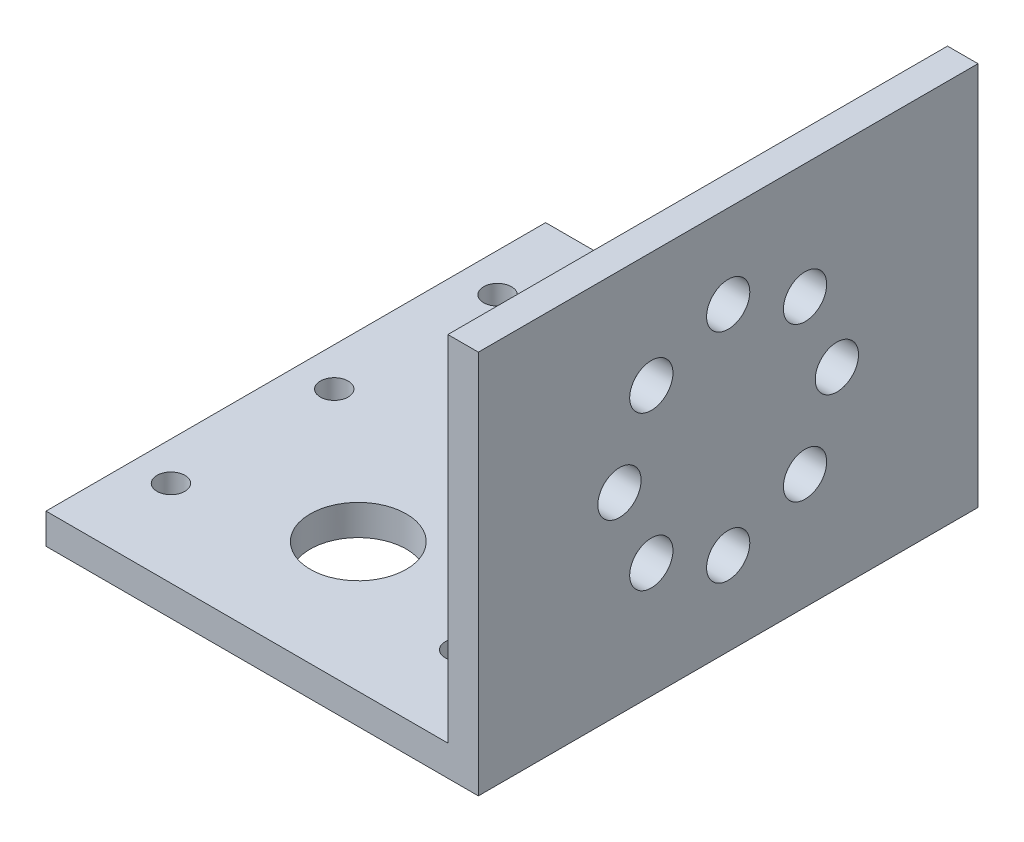
ISO-10303-21;
HEADER;
FILE_DESCRIPTION(('STEP AP214'),'2;1');
FILE_NAME('part.step','',(''),(''),'','','');
FILE_SCHEMA(('AUTOMOTIVE_DESIGN { 1 0 10303 214 1 1 1 1 }'));
ENDSEC;
DATA;
#1=APPLICATION_CONTEXT('core data for automotive mechanical design processes');
#2=APPLICATION_PROTOCOL_DEFINITION('international standard','automotive_design',2000,#1);
#3=PRODUCT_CONTEXT('',#1,'mechanical');
#4=PRODUCT('Part','Part','',(#3));
#5=PRODUCT_RELATED_PRODUCT_CATEGORY('part','',(#4));
#6=PRODUCT_DEFINITION_FORMATION('','',#4);
#7=PRODUCT_DEFINITION_CONTEXT('part definition',#1,'design');
#8=PRODUCT_DEFINITION('design','',#6,#7);
#9=PRODUCT_DEFINITION_SHAPE('','',#8);
#10=(LENGTH_UNIT() NAMED_UNIT(*) SI_UNIT(.MILLI.,.METRE.));
#11=(NAMED_UNIT(*) PLANE_ANGLE_UNIT() SI_UNIT($,.RADIAN.));
#12=(NAMED_UNIT(*) SI_UNIT($,.STERADIAN.) SOLID_ANGLE_UNIT());
#13=UNCERTAINTY_MEASURE_WITH_UNIT(LENGTH_MEASURE(1.E-05),#10,'distance_accuracy_value','');
#14=(GEOMETRIC_REPRESENTATION_CONTEXT(3) GLOBAL_UNCERTAINTY_ASSIGNED_CONTEXT((#13)) GLOBAL_UNIT_ASSIGNED_CONTEXT((#10,
#11,#12)) REPRESENTATION_CONTEXT('',''));
#15=CARTESIAN_POINT('',(0.,0.,0.));
#16=DIRECTION('',(0.,0.,1.));
#17=DIRECTION('',(1.,0.,0.));
#18=AXIS2_PLACEMENT_3D('',#15,#16,#17);
#19=CARTESIAN_POINT('',(3.175,36.825,52.));
#20=DIRECTION('',(-1.,0.,0.));
#21=DIRECTION('',(0.,-1.,0.));
#22=AXIS2_PLACEMENT_3D('',#19,#20,#21);
#23=PLANE('',#22);
#24=CARTESIAN_POINT('',(3.175,28.1387084989848,26.));
#25=DIRECTION('',(1.,0.,0.));
#26=DIRECTION('',(0.,0.,-1.));
#27=AXIS2_PLACEMENT_3D('',#24,#25,#26);
#28=CIRCLE('',#27,2.25);
#29=CARTESIAN_POINT('',(3.175,28.1387084989848,23.75));
#30=VERTEX_POINT('',#29);
#31=EDGE_CURVE('E225',#30,#30,#28,.T.);
#32=ORIENTED_EDGE('',*,*,#31,.F.);
#33=EDGE_LOOP('',(#32));
#34=FACE_BOUND('',#33,.T.);
#35=CARTESIAN_POINT('',(3.175,16.825,14.6862915010152));
#36=DIRECTION('',(1.,0.,0.));
#37=DIRECTION('',(0.,0.,-1.));
#38=AXIS2_PLACEMENT_3D('',#35,#36,#37);
#39=CIRCLE('',#38,2.25);
#40=CARTESIAN_POINT('',(3.175,16.825,12.4362915010152));
#41=VERTEX_POINT('',#40);
#42=EDGE_CURVE('E210',#41,#41,#39,.T.);
#43=ORIENTED_EDGE('',*,*,#42,.F.);
#44=EDGE_LOOP('',(#43));
#45=FACE_BOUND('',#44,.T.);
#46=CARTESIAN_POINT('',(3.175,8.825,18.));
#47=DIRECTION('',(1.,0.,0.));
#48=DIRECTION('',(0.,0.,-1.));
#49=AXIS2_PLACEMENT_3D('',#46,#47,#48);
#50=CIRCLE('',#49,2.25);
#51=CARTESIAN_POINT('',(3.175,8.825,15.75));
#52=VERTEX_POINT('',#51);
#53=EDGE_CURVE('E206',#52,#52,#50,.T.);
#54=ORIENTED_EDGE('',*,*,#53,.F.);
#55=EDGE_LOOP('',(#54));
#56=FACE_BOUND('',#55,.T.);
#57=CARTESIAN_POINT('',(3.175,5.51129150101524,26.));
#58=DIRECTION('',(1.,0.,0.));
#59=DIRECTION('',(0.,0.,-1.));
#60=AXIS2_PLACEMENT_3D('',#57,#58,#59);
#61=CIRCLE('',#60,2.25);
#62=CARTESIAN_POINT('',(3.175,5.51129150101524,23.75));
#63=VERTEX_POINT('',#62);
#64=EDGE_CURVE('E202',#63,#63,#61,.T.);
#65=ORIENTED_EDGE('',*,*,#64,.F.);
#66=EDGE_LOOP('',(#65));
#67=FACE_BOUND('',#66,.T.);
#68=CARTESIAN_POINT('',(3.175,8.825,34.));
#69=DIRECTION('',(1.,0.,0.));
#70=DIRECTION('',(0.,0.,-1.));
#71=AXIS2_PLACEMENT_3D('',#68,#69,#70);
#72=CIRCLE('',#71,2.25);
#73=CARTESIAN_POINT('',(3.175,8.825,31.75));
#74=VERTEX_POINT('',#73);
#75=EDGE_CURVE('E197',#74,#74,#72,.T.);
#76=ORIENTED_EDGE('',*,*,#75,.F.);
#77=EDGE_LOOP('',(#76));
#78=FACE_BOUND('',#77,.T.);
#79=CARTESIAN_POINT('',(3.175,16.825,37.3137084989848));
#80=DIRECTION('',(1.,0.,0.));
#81=DIRECTION('',(0.,0.,-1.));
#82=AXIS2_PLACEMENT_3D('',#79,#80,#81);
#83=CIRCLE('',#82,2.25);
#84=CARTESIAN_POINT('',(3.175,16.825,35.0637084989848));
#85=VERTEX_POINT('',#84);
#86=EDGE_CURVE('E192',#85,#85,#83,.T.);
#87=ORIENTED_EDGE('',*,*,#86,.F.);
#88=EDGE_LOOP('',(#87));
#89=FACE_BOUND('',#88,.T.);
#90=CARTESIAN_POINT('',(3.175,24.825,34.));
#91=DIRECTION('',(1.,0.,0.));
#92=DIRECTION('',(0.,0.,-1.));
#93=AXIS2_PLACEMENT_3D('',#90,#91,#92);
#94=CIRCLE('',#93,2.25);
#95=CARTESIAN_POINT('',(3.175,24.825,31.75));
#96=VERTEX_POINT('',#95);
#97=EDGE_CURVE('E187',#96,#96,#94,.T.);
#98=ORIENTED_EDGE('',*,*,#97,.F.);
#99=EDGE_LOOP('',(#98));
#100=FACE_BOUND('',#99,.T.);
#101=DIRECTION('',(0.,1.,0.));
#102=VECTOR('',#101,1.);
#103=CARTESIAN_POINT('',(3.175,36.825,0.));
#104=LINE('',#103,#102);
#105=CARTESIAN_POINT('',(3.175,-3.175,0.));
#106=VERTEX_POINT('',#105);
#107=CARTESIAN_POINT('',(3.175,36.825,0.));
#108=VERTEX_POINT('',#107);
#109=EDGE_CURVE('E121',#106,#108,#104,.T.);
#110=ORIENTED_EDGE('',*,*,#109,.T.);
#111=DIRECTION('',(0.,0.,-1.));
#112=VECTOR('',#111,1.);
#113=CARTESIAN_POINT('',(3.175,36.825,52.));
#114=LINE('',#113,#112);
#115=CARTESIAN_POINT('',(3.175,36.825,52.));
#116=VERTEX_POINT('',#115);
#117=EDGE_CURVE('E118',#116,#108,#114,.T.);
#118=ORIENTED_EDGE('',*,*,#117,.F.);
#119=DIRECTION('',(0.,1.,0.));
#120=VECTOR('',#119,1.);
#121=CARTESIAN_POINT('',(3.175,36.825,52.));
#122=LINE('',#121,#120);
#123=CARTESIAN_POINT('',(3.175,-3.175,52.));
#124=VERTEX_POINT('',#123);
#125=EDGE_CURVE('E106',#124,#116,#122,.T.);
#126=ORIENTED_EDGE('',*,*,#125,.F.);
#127=DIRECTION('',(0.,0.,-1.));
#128=VECTOR('',#127,1.);
#129=CARTESIAN_POINT('',(3.175,-3.175,52.));
#130=LINE('',#129,#128);
#131=EDGE_CURVE('E123',#124,#106,#130,.T.);
#132=ORIENTED_EDGE('',*,*,#131,.T.);
#133=EDGE_LOOP('',(#110,#118,#126,#132));
#134=FACE_BOUND('',#133,.T.);
#135=CARTESIAN_POINT('',(3.175,24.825,18.));
#136=DIRECTION('',(1.,0.,0.));
#137=DIRECTION('',(0.,0.,-1.));
#138=AXIS2_PLACEMENT_3D('',#135,#136,#137);
#139=CIRCLE('',#138,2.25);
#140=CARTESIAN_POINT('',(3.175,24.825,15.75));
#141=VERTEX_POINT('',#140);
#142=EDGE_CURVE('E211',#141,#141,#139,.T.);
#143=ORIENTED_EDGE('',*,*,#142,.F.);
#144=EDGE_LOOP('',(#143));
#145=FACE_BOUND('',#144,.T.);
#146=ADVANCED_FACE('F42',(#34,#45,#56,#67,#78,#89,#100,#134,#145),#23,.F.);
#147=CARTESIAN_POINT('',(3.175,-3.175,52.));
#148=DIRECTION('',(0.,1.,0.));
#149=DIRECTION('',(-1.,0.,0.));
#150=AXIS2_PLACEMENT_3D('',#147,#148,#149);
#151=PLANE('',#150);
#152=CARTESIAN_POINT('',(-7.825,-3.175,8.99999999999999));
#153=DIRECTION('',(0.,-1.,0.));
#154=DIRECTION('',(0.,0.,-1.));
#155=AXIS2_PLACEMENT_3D('',#152,#153,#154);
#156=CIRCLE('',#155,1.45);
#157=CARTESIAN_POINT('',(-7.825,-3.175,7.55));
#158=VERTEX_POINT('',#157);
#159=EDGE_CURVE('E182',#158,#158,#156,.T.);
#160=ORIENTED_EDGE('',*,*,#159,.F.);
#161=EDGE_LOOP('',(#160));
#162=FACE_BOUND('',#161,.T.);
#163=CARTESIAN_POINT('',(-37.825,-3.175,8.99999999999999));
#164=DIRECTION('',(0.,-1.,0.));
#165=DIRECTION('',(0.,0.,-1.));
#166=AXIS2_PLACEMENT_3D('',#163,#164,#165);
#167=CIRCLE('',#166,1.45);
#168=CARTESIAN_POINT('',(-37.825,-3.175,7.54999999999999));
#169=VERTEX_POINT('',#168);
#170=EDGE_CURVE('E177',#169,#169,#167,.T.);
#171=ORIENTED_EDGE('',*,*,#170,.F.);
#172=EDGE_LOOP('',(#171));
#173=FACE_BOUND('',#172,.T.);
#174=CARTESIAN_POINT('',(-7.82500000000006,-3.175,26.));
#175=DIRECTION('',(0.,-1.,0.));
#176=DIRECTION('',(0.,0.,-1.));
#177=AXIS2_PLACEMENT_3D('',#174,#175,#176);
#178=CIRCLE('',#177,1.45);
#179=CARTESIAN_POINT('',(-7.82500000000006,-3.175,24.55));
#180=VERTEX_POINT('',#179);
#181=EDGE_CURVE('E172',#180,#180,#178,.T.);
#182=ORIENTED_EDGE('',*,*,#181,.F.);
#183=EDGE_LOOP('',(#182));
#184=FACE_BOUND('',#183,.T.);
#185=CARTESIAN_POINT('',(-37.8250000000001,-3.175,26.));
#186=DIRECTION('',(0.,-1.,0.));
#187=DIRECTION('',(0.,0.,-1.));
#188=AXIS2_PLACEMENT_3D('',#185,#186,#187);
#189=CIRCLE('',#188,1.45);
#190=CARTESIAN_POINT('',(-37.8250000000001,-3.175,24.55));
#191=VERTEX_POINT('',#190);
#192=EDGE_CURVE('E171',#191,#191,#189,.T.);
#193=ORIENTED_EDGE('',*,*,#192,.F.);
#194=EDGE_LOOP('',(#193));
#195=FACE_BOUND('',#194,.T.);
#196=CARTESIAN_POINT('',(-37.8250000000001,-3.175,43.));
#197=DIRECTION('',(0.,-1.,0.));
#198=DIRECTION('',(0.,0.,-1.));
#199=AXIS2_PLACEMENT_3D('',#196,#197,#198);
#200=CIRCLE('',#199,1.45);
#201=CARTESIAN_POINT('',(-37.8250000000001,-3.175,41.55));
#202=VERTEX_POINT('',#201);
#203=EDGE_CURVE('E166',#202,#202,#200,.T.);
#204=ORIENTED_EDGE('',*,*,#203,.F.);
#205=EDGE_LOOP('',(#204));
#206=FACE_BOUND('',#205,.T.);
#207=CARTESIAN_POINT('',(-22.825,-3.175,38.5));
#208=DIRECTION('',(0.,-1.,0.));
#209=DIRECTION('',(1.,0.,0.));
#210=AXIS2_PLACEMENT_3D('',#207,#208,#209);
#211=CIRCLE('',#210,5.);
#212=CARTESIAN_POINT('',(-17.825,-3.175,38.5));
#213=VERTEX_POINT('',#212);
#214=EDGE_CURVE('E272',#213,#213,#211,.T.);
#215=ORIENTED_EDGE('',*,*,#214,.F.);
#216=EDGE_LOOP('',(#215));
#217=FACE_BOUND('',#216,.T.);
#218=DIRECTION('',(1.,0.,0.));
#219=VECTOR('',#218,1.);
#220=CARTESIAN_POINT('',(3.175,-3.175,0.));
#221=LINE('',#220,#219);
#222=CARTESIAN_POINT('',(-41.825,-3.175,0.));
#223=VERTEX_POINT('',#222);
#224=EDGE_CURVE('E142',#223,#106,#221,.T.);
#225=ORIENTED_EDGE('',*,*,#224,.T.);
#226=ORIENTED_EDGE('',*,*,#131,.F.);
#227=DIRECTION('',(1.,0.,0.));
#228=VECTOR('',#227,1.);
#229=CARTESIAN_POINT('',(3.175,-3.175,52.));
#230=LINE('',#229,#228);
#231=CARTESIAN_POINT('',(-41.825,-3.175,52.));
#232=VERTEX_POINT('',#231);
#233=EDGE_CURVE('E112',#232,#124,#230,.T.);
#234=ORIENTED_EDGE('',*,*,#233,.F.);
#235=DIRECTION('',(0.,0.,-1.));
#236=VECTOR('',#235,1.);
#237=CARTESIAN_POINT('',(-41.825,-3.175,52.));
#238=LINE('',#237,#236);
#239=EDGE_CURVE('E53',#232,#223,#238,.T.);
#240=ORIENTED_EDGE('',*,*,#239,.T.);
#241=EDGE_LOOP('',(#225,#226,#234,#240));
#242=FACE_BOUND('',#241,.T.);
#243=CARTESIAN_POINT('',(-7.82500000000012,-3.175,43.));
#244=DIRECTION('',(0.,-1.,0.));
#245=DIRECTION('',(0.,0.,-1.));
#246=AXIS2_PLACEMENT_3D('',#243,#244,#245);
#247=CIRCLE('',#246,1.45);
#248=CARTESIAN_POINT('',(-7.82500000000012,-3.175,41.55));
#249=VERTEX_POINT('',#248);
#250=EDGE_CURVE('E165',#249,#249,#247,.T.);
#251=ORIENTED_EDGE('',*,*,#250,.F.);
#252=EDGE_LOOP('',(#251));
#253=FACE_BOUND('',#252,.T.);
#254=ADVANCED_FACE('F288',(#162,#173,#184,#195,#206,#217,#242,#253),#151,.F.);
#255=CARTESIAN_POINT('',(-41.825,0.,52.));
#256=DIRECTION('',(0.,-1.,0.));
#257=DIRECTION('',(0.,0.,-1.));
#258=AXIS2_PLACEMENT_3D('',#255,#256,#257);
#259=PLANE('',#258);
#260=CARTESIAN_POINT('',(-7.825,0.,8.99999999999999));
#261=DIRECTION('',(0.,-1.,0.));
#262=DIRECTION('',(0.,0.,-1.));
#263=AXIS2_PLACEMENT_3D('',#260,#261,#262);
#264=CIRCLE('',#263,1.45);
#265=CARTESIAN_POINT('',(-7.825,0.,7.55));
#266=VERTEX_POINT('',#265);
#267=EDGE_CURVE('E178',#266,#266,#264,.T.);
#268=ORIENTED_EDGE('',*,*,#267,.T.);
#269=EDGE_LOOP('',(#268));
#270=FACE_BOUND('',#269,.T.);
#271=CARTESIAN_POINT('',(-37.825,0.,8.99999999999999));
#272=DIRECTION('',(0.,-1.,0.));
#273=DIRECTION('',(0.,0.,-1.));
#274=AXIS2_PLACEMENT_3D('',#271,#272,#273);
#275=CIRCLE('',#274,1.45);
#276=CARTESIAN_POINT('',(-37.825,0.,7.55));
#277=VERTEX_POINT('',#276);
#278=EDGE_CURVE('E173',#277,#277,#275,.T.);
#279=ORIENTED_EDGE('',*,*,#278,.T.);
#280=EDGE_LOOP('',(#279));
#281=FACE_BOUND('',#280,.T.);
#282=CARTESIAN_POINT('',(-7.82500000000006,0.,26.));
#283=DIRECTION('',(0.,-1.,0.));
#284=DIRECTION('',(0.,0.,-1.));
#285=AXIS2_PLACEMENT_3D('',#282,#283,#284);
#286=CIRCLE('',#285,1.45);
#287=CARTESIAN_POINT('',(-7.82500000000006,0.,24.55));
#288=VERTEX_POINT('',#287);
#289=EDGE_CURVE('E167',#288,#288,#286,.T.);
#290=ORIENTED_EDGE('',*,*,#289,.T.);
#291=EDGE_LOOP('',(#290));
#292=FACE_BOUND('',#291,.T.);
#293=CARTESIAN_POINT('',(-37.8250000000001,0.,26.));
#294=DIRECTION('',(0.,-1.,0.));
#295=DIRECTION('',(0.,0.,-1.));
#296=AXIS2_PLACEMENT_3D('',#293,#294,#295);
#297=CIRCLE('',#296,1.45);
#298=CARTESIAN_POINT('',(-37.8250000000001,0.,24.55));
#299=VERTEX_POINT('',#298);
#300=EDGE_CURVE('E258',#299,#299,#297,.T.);
#301=ORIENTED_EDGE('',*,*,#300,.T.);
#302=EDGE_LOOP('',(#301));
#303=FACE_BOUND('',#302,.T.);
#304=CARTESIAN_POINT('',(-37.8250000000001,0.,43.));
#305=DIRECTION('',(0.,-1.,0.));
#306=DIRECTION('',(0.,0.,-1.));
#307=AXIS2_PLACEMENT_3D('',#304,#305,#306);
#308=CIRCLE('',#307,1.45);
#309=CARTESIAN_POINT('',(-37.8250000000001,0.,41.55));
#310=VERTEX_POINT('',#309);
#311=EDGE_CURVE('E161',#310,#310,#308,.T.);
#312=ORIENTED_EDGE('',*,*,#311,.T.);
#313=EDGE_LOOP('',(#312));
#314=FACE_BOUND('',#313,.T.);
#315=CARTESIAN_POINT('',(-7.82500000000012,0.,43.));
#316=DIRECTION('',(0.,-1.,0.));
#317=DIRECTION('',(0.,0.,-1.));
#318=AXIS2_PLACEMENT_3D('',#315,#316,#317);
#319=CIRCLE('',#318,1.45);
#320=CARTESIAN_POINT('',(-7.82500000000012,0.,41.55));
#321=VERTEX_POINT('',#320);
#322=EDGE_CURVE('E268',#321,#321,#319,.T.);
#323=ORIENTED_EDGE('',*,*,#322,.T.);
#324=EDGE_LOOP('',(#323));
#325=FACE_BOUND('',#324,.T.);
#326=CARTESIAN_POINT('',(-22.825,0.,38.5));
#327=DIRECTION('',(0.,-1.,0.));
#328=DIRECTION('',(0.,0.,-1.));
#329=AXIS2_PLACEMENT_3D('',#326,#327,#328);
#330=CIRCLE('',#329,5.);
#331=CARTESIAN_POINT('',(-22.825,0.,33.5));
#332=VERTEX_POINT('',#331);
#333=EDGE_CURVE('E139',#332,#332,#330,.T.);
#334=ORIENTED_EDGE('',*,*,#333,.T.);
#335=EDGE_LOOP('',(#334));
#336=FACE_BOUND('',#335,.T.);
#337=DIRECTION('',(-1.,0.,0.));
#338=VECTOR('',#337,1.);
#339=CARTESIAN_POINT('',(-41.825,0.,0.));
#340=LINE('',#339,#338);
#341=CARTESIAN_POINT('',(0.,0.,0.));
#342=VERTEX_POINT('',#341);
#343=CARTESIAN_POINT('',(-41.825,0.,0.));
#344=VERTEX_POINT('',#343);
#345=EDGE_CURVE('E134',#342,#344,#340,.T.);
#346=ORIENTED_EDGE('',*,*,#345,.T.);
#347=DIRECTION('',(0.,0.,-1.));
#348=VECTOR('',#347,1.);
#349=CARTESIAN_POINT('',(-41.825,0.,52.));
#350=LINE('',#349,#348);
#351=CARTESIAN_POINT('',(-41.825,0.,52.));
#352=VERTEX_POINT('',#351);
#353=EDGE_CURVE('E11',#352,#344,#350,.T.);
#354=ORIENTED_EDGE('',*,*,#353,.F.);
#355=DIRECTION('',(-1.,0.,0.));
#356=VECTOR('',#355,1.);
#357=CARTESIAN_POINT('',(-41.825,0.,52.));
#358=LINE('',#357,#356);
#359=CARTESIAN_POINT('',(0.,0.,52.));
#360=VERTEX_POINT('',#359);
#361=EDGE_CURVE('E151',#360,#352,#358,.T.);
#362=ORIENTED_EDGE('',*,*,#361,.F.);
#363=DIRECTION('',(0.,0.,-1.));
#364=VECTOR('',#363,1.);
#365=CARTESIAN_POINT('',(0.,0.,52.));
#366=LINE('',#365,#364);
#367=EDGE_CURVE('E130',#360,#342,#366,.T.);
#368=ORIENTED_EDGE('',*,*,#367,.T.);
#369=EDGE_LOOP('',(#346,#354,#362,#368));
#370=FACE_BOUND('',#369,.T.);
#371=ADVANCED_FACE('F44',(#270,#281,#292,#303,#314,#325,#336,#370),#259,.F.);
#372=CARTESIAN_POINT('',(-41.825,-3.175,52.));
#373=DIRECTION('',(1.,0.,0.));
#374=DIRECTION('',(0.,0.,-1.));
#375=AXIS2_PLACEMENT_3D('',#372,#373,#374);
#376=PLANE('',#375);
#377=DIRECTION('',(0.,-1.,0.));
#378=VECTOR('',#377,1.);
#379=CARTESIAN_POINT('',(-41.825,-3.175,0.));
#380=LINE('',#379,#378);
#381=EDGE_CURVE('E138',#344,#223,#380,.T.);
#382=ORIENTED_EDGE('',*,*,#381,.T.);
#383=ORIENTED_EDGE('',*,*,#239,.F.);
#384=DIRECTION('',(0.,-1.,0.));
#385=VECTOR('',#384,1.);
#386=CARTESIAN_POINT('',(-41.825,-3.175,52.));
#387=LINE('',#386,#385);
#388=EDGE_CURVE('E99',#352,#232,#387,.T.);
#389=ORIENTED_EDGE('',*,*,#388,.F.);
#390=ORIENTED_EDGE('',*,*,#353,.T.);
#391=EDGE_LOOP('',(#382,#383,#389,#390));
#392=FACE_BOUND('',#391,.T.);
#393=ADVANCED_FACE('F285',(#392),#376,.F.);
#394=CARTESIAN_POINT('',(0.,36.825,52.));
#395=DIRECTION('',(0.,-1.,0.));
#396=DIRECTION('',(0.,0.,-1.));
#397=AXIS2_PLACEMENT_3D('',#394,#395,#396);
#398=PLANE('',#397);
#399=DIRECTION('',(-1.,0.,0.));
#400=VECTOR('',#399,1.);
#401=CARTESIAN_POINT('',(0.,36.825,0.));
#402=LINE('',#401,#400);
#403=CARTESIAN_POINT('',(0.,36.825,0.));
#404=VERTEX_POINT('',#403);
#405=EDGE_CURVE('E85',#108,#404,#402,.T.);
#406=ORIENTED_EDGE('',*,*,#405,.T.);
#407=DIRECTION('',(0.,0.,-1.));
#408=VECTOR('',#407,1.);
#409=CARTESIAN_POINT('',(0.,36.825,52.));
#410=LINE('',#409,#408);
#411=CARTESIAN_POINT('',(0.,36.825,52.));
#412=VERTEX_POINT('',#411);
#413=EDGE_CURVE('E124',#412,#404,#410,.T.);
#414=ORIENTED_EDGE('',*,*,#413,.F.);
#415=DIRECTION('',(-1.,0.,0.));
#416=VECTOR('',#415,1.);
#417=CARTESIAN_POINT('',(0.,36.825,52.));
#418=LINE('',#417,#416);
#419=EDGE_CURVE('E110',#116,#412,#418,.T.);
#420=ORIENTED_EDGE('',*,*,#419,.F.);
#421=ORIENTED_EDGE('',*,*,#117,.T.);
#422=EDGE_LOOP('',(#406,#414,#420,#421));
#423=FACE_BOUND('',#422,.T.);
#424=ADVANCED_FACE('F126',(#423),#398,.F.);
#425=CARTESIAN_POINT('',(0.,0.,52.));
#426=DIRECTION('',(1.,0.,0.));
#427=DIRECTION('',(0.,1.,0.));
#428=AXIS2_PLACEMENT_3D('',#425,#426,#427);
#429=PLANE('',#428);
#430=CARTESIAN_POINT('',(0.,28.1387084989848,26.));
#431=DIRECTION('',(1.,0.,0.));
#432=DIRECTION('',(0.,1.,0.));
#433=AXIS2_PLACEMENT_3D('',#430,#431,#432);
#434=CIRCLE('',#433,2.25);
#435=CARTESIAN_POINT('',(0.,30.3887084989848,26.));
#436=VERTEX_POINT('',#435);
#437=EDGE_CURVE('E46',#436,#436,#434,.T.);
#438=ORIENTED_EDGE('',*,*,#437,.T.);
#439=EDGE_LOOP('',(#438));
#440=FACE_BOUND('',#439,.T.);
#441=CARTESIAN_POINT('',(0.,24.825,18.));
#442=DIRECTION('',(1.,0.,0.));
#443=DIRECTION('',(0.,1.,0.));
#444=AXIS2_PLACEMENT_3D('',#441,#442,#443);
#445=CIRCLE('',#444,2.25);
#446=CARTESIAN_POINT('',(0.,27.075,18.));
#447=VERTEX_POINT('',#446);
#448=EDGE_CURVE('E207',#447,#447,#445,.T.);
#449=ORIENTED_EDGE('',*,*,#448,.T.);
#450=EDGE_LOOP('',(#449));
#451=FACE_BOUND('',#450,.T.);
#452=CARTESIAN_POINT('',(0.,16.825,14.6862915010152));
#453=DIRECTION('',(1.,0.,0.));
#454=DIRECTION('',(0.,1.,0.));
#455=AXIS2_PLACEMENT_3D('',#452,#453,#454);
#456=CIRCLE('',#455,2.25);
#457=CARTESIAN_POINT('',(0.,19.075,14.6862915010152));
#458=VERTEX_POINT('',#457);
#459=EDGE_CURVE('E217',#458,#458,#456,.T.);
#460=ORIENTED_EDGE('',*,*,#459,.T.);
#461=EDGE_LOOP('',(#460));
#462=FACE_BOUND('',#461,.T.);
#463=CARTESIAN_POINT('',(0.,8.825,18.));
#464=DIRECTION('',(1.,0.,0.));
#465=DIRECTION('',(0.,1.,0.));
#466=AXIS2_PLACEMENT_3D('',#463,#464,#465);
#467=CIRCLE('',#466,2.25);
#468=CARTESIAN_POINT('',(0.,11.075,18.));
#469=VERTEX_POINT('',#468);
#470=EDGE_CURVE('E203',#469,#469,#467,.T.);
#471=ORIENTED_EDGE('',*,*,#470,.T.);
#472=EDGE_LOOP('',(#471));
#473=FACE_BOUND('',#472,.T.);
#474=CARTESIAN_POINT('',(0.,5.51129150101524,26.));
#475=DIRECTION('',(1.,0.,0.));
#476=DIRECTION('',(0.,1.,0.));
#477=AXIS2_PLACEMENT_3D('',#474,#475,#476);
#478=CIRCLE('',#477,2.25);
#479=CARTESIAN_POINT('',(0.,7.76129150101523,26.));
#480=VERTEX_POINT('',#479);
#481=EDGE_CURVE('E198',#480,#480,#478,.T.);
#482=ORIENTED_EDGE('',*,*,#481,.T.);
#483=EDGE_LOOP('',(#482));
#484=FACE_BOUND('',#483,.T.);
#485=CARTESIAN_POINT('',(0.,8.825,34.));
#486=DIRECTION('',(1.,0.,0.));
#487=DIRECTION('',(0.,1.,0.));
#488=AXIS2_PLACEMENT_3D('',#485,#486,#487);
#489=CIRCLE('',#488,2.25);
#490=CARTESIAN_POINT('',(0.,11.075,34.));
#491=VERTEX_POINT('',#490);
#492=EDGE_CURVE('E193',#491,#491,#489,.T.);
#493=ORIENTED_EDGE('',*,*,#492,.T.);
#494=EDGE_LOOP('',(#493));
#495=FACE_BOUND('',#494,.T.);
#496=CARTESIAN_POINT('',(0.,16.825,37.3137084989848));
#497=DIRECTION('',(1.,0.,0.));
#498=DIRECTION('',(0.,1.,0.));
#499=AXIS2_PLACEMENT_3D('',#496,#497,#498);
#500=CIRCLE('',#499,2.25);
#501=CARTESIAN_POINT('',(0.,19.075,37.3137084989848));
#502=VERTEX_POINT('',#501);
#503=EDGE_CURVE('E188',#502,#502,#500,.T.);
#504=ORIENTED_EDGE('',*,*,#503,.T.);
#505=EDGE_LOOP('',(#504));
#506=FACE_BOUND('',#505,.T.);
#507=CARTESIAN_POINT('',(0.,24.825,34.));
#508=DIRECTION('',(1.,0.,0.));
#509=DIRECTION('',(0.,1.,0.));
#510=AXIS2_PLACEMENT_3D('',#507,#508,#509);
#511=CIRCLE('',#510,2.25);
#512=CARTESIAN_POINT('',(0.,27.075,34.));
#513=VERTEX_POINT('',#512);
#514=EDGE_CURVE('E183',#513,#513,#511,.T.);
#515=ORIENTED_EDGE('',*,*,#514,.T.);
#516=EDGE_LOOP('',(#515));
#517=FACE_BOUND('',#516,.T.);
#518=DIRECTION('',(0.,-1.,0.));
#519=VECTOR('',#518,1.);
#520=CARTESIAN_POINT('',(0.,0.,0.));
#521=LINE('',#520,#519);
#522=EDGE_CURVE('E91',#404,#342,#521,.T.);
#523=ORIENTED_EDGE('',*,*,#522,.T.);
#524=ORIENTED_EDGE('',*,*,#367,.F.);
#525=DIRECTION('',(0.,-1.,0.));
#526=VECTOR('',#525,1.);
#527=CARTESIAN_POINT('',(0.,0.,52.));
#528=LINE('',#527,#526);
#529=EDGE_CURVE('E62',#412,#360,#528,.T.);
#530=ORIENTED_EDGE('',*,*,#529,.F.);
#531=ORIENTED_EDGE('',*,*,#413,.T.);
#532=EDGE_LOOP('',(#523,#524,#530,#531));
#533=FACE_BOUND('',#532,.T.);
#534=ADVANCED_FACE('F294',(#440,#451,#462,#473,#484,#495,#506,#517,#533),#429,.F.);
#535=CARTESIAN_POINT('',(0.,0.,52.));
#536=DIRECTION('',(0.,0.,1.));
#537=DIRECTION('',(1.,0.,0.));
#538=AXIS2_PLACEMENT_3D('',#535,#536,#537);
#539=PLANE('',#538);
#540=ORIENTED_EDGE('',*,*,#361,.T.);
#541=ORIENTED_EDGE('',*,*,#388,.T.);
#542=ORIENTED_EDGE('',*,*,#233,.T.);
#543=ORIENTED_EDGE('',*,*,#125,.T.);
#544=ORIENTED_EDGE('',*,*,#419,.T.);
#545=ORIENTED_EDGE('',*,*,#529,.T.);
#546=EDGE_LOOP('',(#540,#541,#542,#543,#544,#545));
#547=FACE_BOUND('',#546,.T.);
#548=ADVANCED_FACE('F108',(#547),#539,.T.);
#549=CARTESIAN_POINT('',(0.,0.,0.));
#550=DIRECTION('',(0.,0.,1.));
#551=DIRECTION('',(1.,0.,0.));
#552=AXIS2_PLACEMENT_3D('',#549,#550,#551);
#553=PLANE('',#552);
#554=ORIENTED_EDGE('',*,*,#345,.F.);
#555=ORIENTED_EDGE('',*,*,#522,.F.);
#556=ORIENTED_EDGE('',*,*,#405,.F.);
#557=ORIENTED_EDGE('',*,*,#109,.F.);
#558=ORIENTED_EDGE('',*,*,#224,.F.);
#559=ORIENTED_EDGE('',*,*,#381,.F.);
#560=EDGE_LOOP('',(#554,#555,#556,#557,#558,#559));
#561=FACE_BOUND('',#560,.T.);
#562=ADVANCED_FACE('F292',(#561),#553,.F.);
#563=CARTESIAN_POINT('',(-22.825,36.825,38.5));
#564=DIRECTION('',(0.,-1.,0.));
#565=DIRECTION('',(1.,0.,0.));
#566=AXIS2_PLACEMENT_3D('',#563,#564,#565);
#567=CYLINDRICAL_SURFACE('',#566,5.);
#568=ORIENTED_EDGE('',*,*,#214,.T.);
#569=EDGE_LOOP('',(#568));
#570=FACE_BOUND('',#569,.T.);
#571=ORIENTED_EDGE('',*,*,#333,.F.);
#572=EDGE_LOOP('',(#571));
#573=FACE_BOUND('',#572,.T.);
#574=ADVANCED_FACE('F336',(#570,#573),#567,.F.);
#575=CARTESIAN_POINT('',(-7.82500000000012,-3.175,43.));
#576=DIRECTION('',(0.,-1.,0.));
#577=DIRECTION('',(0.,0.,-1.));
#578=AXIS2_PLACEMENT_3D('',#575,#576,#577);
#579=CYLINDRICAL_SURFACE('',#578,1.45);
#580=ORIENTED_EDGE('',*,*,#250,.T.);
#581=EDGE_LOOP('',(#580));
#582=FACE_BOUND('',#581,.T.);
#583=ORIENTED_EDGE('',*,*,#322,.F.);
#584=EDGE_LOOP('',(#583));
#585=FACE_BOUND('',#584,.T.);
#586=ADVANCED_FACE('F338',(#582,#585),#579,.F.);
#587=CARTESIAN_POINT('',(-37.8250000000001,-3.175,43.));
#588=DIRECTION('',(0.,-1.,0.));
#589=DIRECTION('',(0.,0.,-1.));
#590=AXIS2_PLACEMENT_3D('',#587,#588,#589);
#591=CYLINDRICAL_SURFACE('',#590,1.45);
#592=ORIENTED_EDGE('',*,*,#203,.T.);
#593=EDGE_LOOP('',(#592));
#594=FACE_BOUND('',#593,.T.);
#595=ORIENTED_EDGE('',*,*,#311,.F.);
#596=EDGE_LOOP('',(#595));
#597=FACE_BOUND('',#596,.T.);
#598=ADVANCED_FACE('F345',(#594,#597),#591,.F.);
#599=CARTESIAN_POINT('',(-37.8250000000001,-3.175,26.));
#600=DIRECTION('',(0.,-1.,0.));
#601=DIRECTION('',(0.,0.,-1.));
#602=AXIS2_PLACEMENT_3D('',#599,#600,#601);
#603=CYLINDRICAL_SURFACE('',#602,1.45);
#604=ORIENTED_EDGE('',*,*,#192,.T.);
#605=EDGE_LOOP('',(#604));
#606=FACE_BOUND('',#605,.T.);
#607=ORIENTED_EDGE('',*,*,#300,.F.);
#608=EDGE_LOOP('',(#607));
#609=FACE_BOUND('',#608,.T.);
#610=ADVANCED_FACE('F351',(#606,#609),#603,.F.);
#611=CARTESIAN_POINT('',(-7.82500000000006,-3.175,26.));
#612=DIRECTION('',(0.,-1.,0.));
#613=DIRECTION('',(0.,0.,-1.));
#614=AXIS2_PLACEMENT_3D('',#611,#612,#613);
#615=CYLINDRICAL_SURFACE('',#614,1.45);
#616=ORIENTED_EDGE('',*,*,#181,.T.);
#617=EDGE_LOOP('',(#616));
#618=FACE_BOUND('',#617,.T.);
#619=ORIENTED_EDGE('',*,*,#289,.F.);
#620=EDGE_LOOP('',(#619));
#621=FACE_BOUND('',#620,.T.);
#622=ADVANCED_FACE('F355',(#618,#621),#615,.F.);
#623=CARTESIAN_POINT('',(-37.825,-3.175,8.99999999999999));
#624=DIRECTION('',(0.,-1.,0.));
#625=DIRECTION('',(0.,0.,-1.));
#626=AXIS2_PLACEMENT_3D('',#623,#624,#625);
#627=CYLINDRICAL_SURFACE('',#626,1.45);
#628=ORIENTED_EDGE('',*,*,#170,.T.);
#629=EDGE_LOOP('',(#628));
#630=FACE_BOUND('',#629,.T.);
#631=ORIENTED_EDGE('',*,*,#278,.F.);
#632=EDGE_LOOP('',(#631));
#633=FACE_BOUND('',#632,.T.);
#634=ADVANCED_FACE('F359',(#630,#633),#627,.F.);
#635=CARTESIAN_POINT('',(-7.825,-3.175,8.99999999999999));
#636=DIRECTION('',(0.,-1.,0.));
#637=DIRECTION('',(0.,0.,-1.));
#638=AXIS2_PLACEMENT_3D('',#635,#636,#637);
#639=CYLINDRICAL_SURFACE('',#638,1.45);
#640=ORIENTED_EDGE('',*,*,#159,.T.);
#641=EDGE_LOOP('',(#640));
#642=FACE_BOUND('',#641,.T.);
#643=ORIENTED_EDGE('',*,*,#267,.F.);
#644=EDGE_LOOP('',(#643));
#645=FACE_BOUND('',#644,.T.);
#646=ADVANCED_FACE('F363',(#642,#645),#639,.F.);
#647=CARTESIAN_POINT('',(3.175,24.825,34.));
#648=DIRECTION('',(1.,0.,0.));
#649=DIRECTION('',(0.,0.,-1.));
#650=AXIS2_PLACEMENT_3D('',#647,#648,#649);
#651=CYLINDRICAL_SURFACE('',#650,2.25);
#652=ORIENTED_EDGE('',*,*,#97,.T.);
#653=EDGE_LOOP('',(#652));
#654=FACE_BOUND('',#653,.T.);
#655=ORIENTED_EDGE('',*,*,#514,.F.);
#656=EDGE_LOOP('',(#655));
#657=FACE_BOUND('',#656,.T.);
#658=ADVANCED_FACE('F367',(#654,#657),#651,.F.);
#659=CARTESIAN_POINT('',(3.175,16.825,37.3137084989848));
#660=DIRECTION('',(1.,0.,0.));
#661=DIRECTION('',(0.,0.,-1.));
#662=AXIS2_PLACEMENT_3D('',#659,#660,#661);
#663=CYLINDRICAL_SURFACE('',#662,2.25);
#664=ORIENTED_EDGE('',*,*,#86,.T.);
#665=EDGE_LOOP('',(#664));
#666=FACE_BOUND('',#665,.T.);
#667=ORIENTED_EDGE('',*,*,#503,.F.);
#668=EDGE_LOOP('',(#667));
#669=FACE_BOUND('',#668,.T.);
#670=ADVANCED_FACE('F371',(#666,#669),#663,.F.);
#671=CARTESIAN_POINT('',(3.175,8.825,34.));
#672=DIRECTION('',(1.,0.,0.));
#673=DIRECTION('',(0.,0.,-1.));
#674=AXIS2_PLACEMENT_3D('',#671,#672,#673);
#675=CYLINDRICAL_SURFACE('',#674,2.25);
#676=ORIENTED_EDGE('',*,*,#75,.T.);
#677=EDGE_LOOP('',(#676));
#678=FACE_BOUND('',#677,.T.);
#679=ORIENTED_EDGE('',*,*,#492,.F.);
#680=EDGE_LOOP('',(#679));
#681=FACE_BOUND('',#680,.T.);
#682=ADVANCED_FACE('F375',(#678,#681),#675,.F.);
#683=CARTESIAN_POINT('',(3.175,5.51129150101524,26.));
#684=DIRECTION('',(1.,0.,0.));
#685=DIRECTION('',(0.,0.,-1.));
#686=AXIS2_PLACEMENT_3D('',#683,#684,#685);
#687=CYLINDRICAL_SURFACE('',#686,2.25);
#688=ORIENTED_EDGE('',*,*,#64,.T.);
#689=EDGE_LOOP('',(#688));
#690=FACE_BOUND('',#689,.T.);
#691=ORIENTED_EDGE('',*,*,#481,.F.);
#692=EDGE_LOOP('',(#691));
#693=FACE_BOUND('',#692,.T.);
#694=ADVANCED_FACE('F379',(#690,#693),#687,.F.);
#695=CARTESIAN_POINT('',(3.175,8.825,18.));
#696=DIRECTION('',(1.,0.,0.));
#697=DIRECTION('',(0.,0.,-1.));
#698=AXIS2_PLACEMENT_3D('',#695,#696,#697);
#699=CYLINDRICAL_SURFACE('',#698,2.25);
#700=ORIENTED_EDGE('',*,*,#53,.T.);
#701=EDGE_LOOP('',(#700));
#702=FACE_BOUND('',#701,.T.);
#703=ORIENTED_EDGE('',*,*,#470,.F.);
#704=EDGE_LOOP('',(#703));
#705=FACE_BOUND('',#704,.T.);
#706=ADVANCED_FACE('F383',(#702,#705),#699,.F.);
#707=CARTESIAN_POINT('',(3.175,16.825,14.6862915010152));
#708=DIRECTION('',(1.,0.,0.));
#709=DIRECTION('',(0.,0.,-1.));
#710=AXIS2_PLACEMENT_3D('',#707,#708,#709);
#711=CYLINDRICAL_SURFACE('',#710,2.25);
#712=ORIENTED_EDGE('',*,*,#42,.T.);
#713=EDGE_LOOP('',(#712));
#714=FACE_BOUND('',#713,.T.);
#715=ORIENTED_EDGE('',*,*,#459,.F.);
#716=EDGE_LOOP('',(#715));
#717=FACE_BOUND('',#716,.T.);
#718=ADVANCED_FACE('F387',(#714,#717),#711,.F.);
#719=CARTESIAN_POINT('',(3.175,24.825,18.));
#720=DIRECTION('',(1.,0.,0.));
#721=DIRECTION('',(0.,0.,-1.));
#722=AXIS2_PLACEMENT_3D('',#719,#720,#721);
#723=CYLINDRICAL_SURFACE('',#722,2.25);
#724=ORIENTED_EDGE('',*,*,#142,.T.);
#725=EDGE_LOOP('',(#724));
#726=FACE_BOUND('',#725,.T.);
#727=ORIENTED_EDGE('',*,*,#448,.F.);
#728=EDGE_LOOP('',(#727));
#729=FACE_BOUND('',#728,.T.);
#730=ADVANCED_FACE('F391',(#726,#729),#723,.F.);
#731=CARTESIAN_POINT('',(3.175,28.1387084989848,26.));
#732=DIRECTION('',(1.,0.,0.));
#733=DIRECTION('',(0.,0.,-1.));
#734=AXIS2_PLACEMENT_3D('',#731,#732,#733);
#735=CYLINDRICAL_SURFACE('',#734,2.25);
#736=ORIENTED_EDGE('',*,*,#31,.T.);
#737=EDGE_LOOP('',(#736));
#738=FACE_BOUND('',#737,.T.);
#739=ORIENTED_EDGE('',*,*,#437,.F.);
#740=EDGE_LOOP('',(#739));
#741=FACE_BOUND('',#740,.T.);
#742=ADVANCED_FACE('F395',(#738,#741),#735,.F.);
#743=CLOSED_SHELL('',(#146,#254,#371,#393,#424,#534,#548,#562,#574,#586,#598,#610,#622,#634,
#646,#658,#670,#682,#694,#706,#718,#730,#742));
#744=MANIFOLD_SOLID_BREP('B2',#743);
#745=ADVANCED_BREP_SHAPE_REPRESENTATION('',(#18,#744),#14);
#746=SHAPE_DEFINITION_REPRESENTATION(#9,#745);
ENDSEC;
END-ISO-10303-21;
